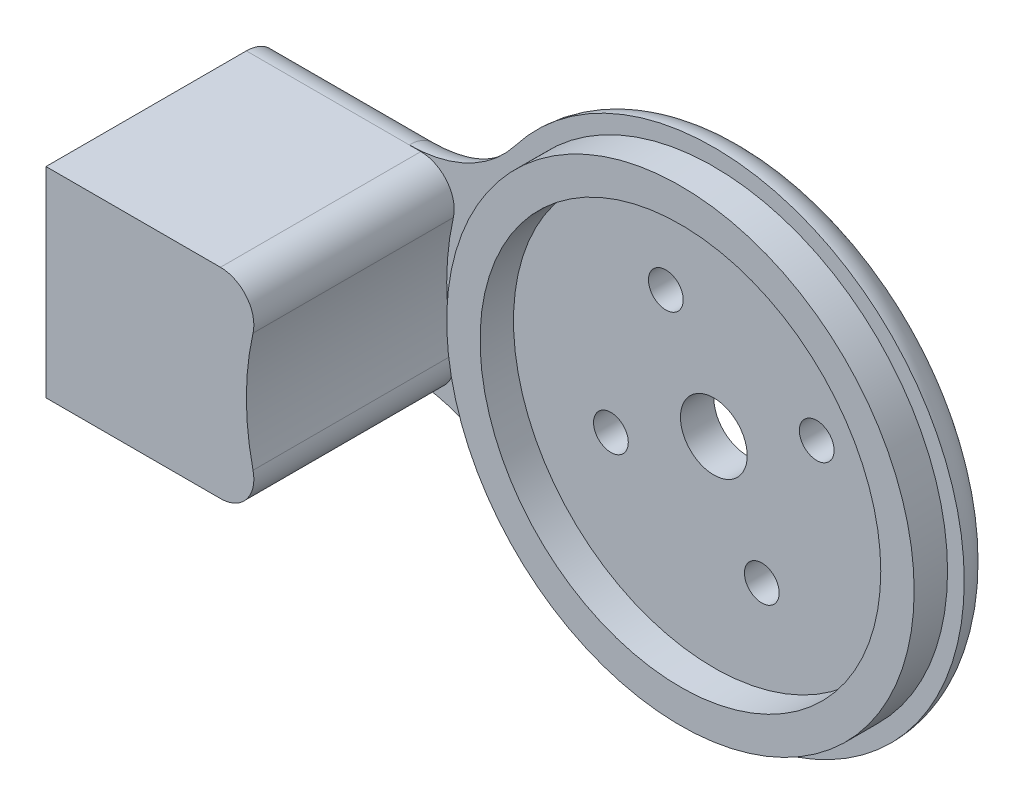
ISO-10303-21;
HEADER;
FILE_DESCRIPTION(('STEP AP214'),'2;1');
FILE_NAME('part.step','',(''),(''),'','','');
FILE_SCHEMA(('AUTOMOTIVE_DESIGN { 1 0 10303 214 1 1 1 1 }'));
ENDSEC;
DATA;
#1=APPLICATION_CONTEXT('core data for automotive mechanical design processes');
#2=APPLICATION_PROTOCOL_DEFINITION('international standard','automotive_design',2000,#1);
#3=PRODUCT_CONTEXT('',#1,'mechanical');
#4=PRODUCT('Part','Part','',(#3));
#5=PRODUCT_RELATED_PRODUCT_CATEGORY('part','',(#4));
#6=PRODUCT_DEFINITION_FORMATION('','',#4);
#7=PRODUCT_DEFINITION_CONTEXT('part definition',#1,'design');
#8=PRODUCT_DEFINITION('design','',#6,#7);
#9=PRODUCT_DEFINITION_SHAPE('','',#8);
#10=(LENGTH_UNIT() NAMED_UNIT(*) SI_UNIT(.MILLI.,.METRE.));
#11=(NAMED_UNIT(*) PLANE_ANGLE_UNIT() SI_UNIT($,.RADIAN.));
#12=(NAMED_UNIT(*) SI_UNIT($,.STERADIAN.) SOLID_ANGLE_UNIT());
#13=UNCERTAINTY_MEASURE_WITH_UNIT(LENGTH_MEASURE(1.E-05),#10,'distance_accuracy_value','');
#14=(GEOMETRIC_REPRESENTATION_CONTEXT(3) GLOBAL_UNCERTAINTY_ASSIGNED_CONTEXT((#13)) GLOBAL_UNIT_ASSIGNED_CONTEXT((#10,
#11,#12)) REPRESENTATION_CONTEXT('',''));
#15=CARTESIAN_POINT('',(0.,0.,0.));
#16=DIRECTION('',(0.,0.,1.));
#17=DIRECTION('',(1.,0.,0.));
#18=AXIS2_PLACEMENT_3D('',#15,#16,#17);
#19=CARTESIAN_POINT('',(-45.6207189772366,35.,5.));
#20=DIRECTION('',(0.,0.,1.));
#21=DIRECTION('',(1.,0.,0.));
#22=AXIS2_PLACEMENT_3D('',#19,#20,#21);
#23=PLANE('',#22);
#24=CARTESIAN_POINT('',(15.4072323796231,7.18451044959179,5.));
#25=DIRECTION('',(0.,0.,1.));
#26=DIRECTION('',(1.,0.,0.));
#27=AXIS2_PLACEMENT_3D('',#24,#25,#26);
#28=CIRCLE('',#27,2.6);
#29=CARTESIAN_POINT('',(18.0072323796231,7.18451044959179,5.));
#30=VERTEX_POINT('',#29);
#31=EDGE_CURVE('E146',#30,#30,#28,.T.);
#32=ORIENTED_EDGE('',*,*,#31,.F.);
#33=EDGE_LOOP('',(#32));
#34=FACE_BOUND('',#33,.T.);
#35=CARTESIAN_POINT('',(-7.18451044959179,15.4072323796231,5.));
#36=DIRECTION('',(0.,0.,1.));
#37=DIRECTION('',(1.,0.,0.));
#38=AXIS2_PLACEMENT_3D('',#35,#36,#37);
#39=CIRCLE('',#38,2.6);
#40=CARTESIAN_POINT('',(-4.58451044959179,15.4072323796231,5.));
#41=VERTEX_POINT('',#40);
#42=EDGE_CURVE('E453',#41,#41,#39,.T.);
#43=ORIENTED_EDGE('',*,*,#42,.F.);
#44=EDGE_LOOP('',(#43));
#45=FACE_BOUND('',#44,.T.);
#46=CARTESIAN_POINT('',(-15.4072323796231,-7.18451044959179,5.));
#47=DIRECTION('',(0.,0.,1.));
#48=DIRECTION('',(1.,0.,0.));
#49=AXIS2_PLACEMENT_3D('',#46,#47,#48);
#50=CIRCLE('',#49,2.6);
#51=CARTESIAN_POINT('',(-12.8072323796231,-7.18451044959179,5.));
#52=VERTEX_POINT('',#51);
#53=EDGE_CURVE('E441',#52,#52,#50,.T.);
#54=ORIENTED_EDGE('',*,*,#53,.F.);
#55=EDGE_LOOP('',(#54));
#56=FACE_BOUND('',#55,.T.);
#57=CARTESIAN_POINT('',(7.18451044959179,-15.4072323796231,5.));
#58=DIRECTION('',(0.,0.,1.));
#59=DIRECTION('',(1.,0.,0.));
#60=AXIS2_PLACEMENT_3D('',#57,#58,#59);
#61=CIRCLE('',#60,2.6);
#62=CARTESIAN_POINT('',(9.78451044959179,-15.4072323796231,5.));
#63=VERTEX_POINT('',#62);
#64=EDGE_CURVE('E438',#63,#63,#61,.T.);
#65=ORIENTED_EDGE('',*,*,#64,.F.);
#66=EDGE_LOOP('',(#65));
#67=FACE_BOUND('',#66,.T.);
#68=CARTESIAN_POINT('',(0.,0.,5.));
#69=DIRECTION('',(0.,0.,1.));
#70=DIRECTION('',(1.,0.,0.));
#71=AXIS2_PLACEMENT_3D('',#68,#69,#70);
#72=CIRCLE('',#71,5.);
#73=CARTESIAN_POINT('',(5.,0.,5.));
#74=VERTEX_POINT('',#73);
#75=EDGE_CURVE('E186',#74,#74,#72,.T.);
#76=ORIENTED_EDGE('',*,*,#75,.F.);
#77=EDGE_LOOP('',(#76));
#78=FACE_BOUND('',#77,.T.);
#79=CARTESIAN_POINT('',(0.,0.,5.));
#80=DIRECTION('',(0.,0.,1.));
#81=DIRECTION('',(1.,0.,0.));
#82=AXIS2_PLACEMENT_3D('',#79,#80,#81);
#83=CIRCLE('',#82,30.);
#84=CARTESIAN_POINT('',(30.,0.,5.));
#85=VERTEX_POINT('',#84);
#86=EDGE_CURVE('E199',#85,#85,#83,.F.);
#87=ORIENTED_EDGE('',*,*,#86,.F.);
#88=EDGE_LOOP('',(#87));
#89=FACE_BOUND('',#88,.T.);
#90=ADVANCED_FACE('F34',(#34,#45,#56,#67,#78,#89),#23,.T.);
#91=CARTESIAN_POINT('',(-45.6207189772366,35.,5.));
#92=DIRECTION('',(0.,0.,-1.));
#93=DIRECTION('',(1.,0.,0.));
#94=AXIS2_PLACEMENT_3D('',#91,#92,#93);
#95=CIRCLE('',#94,20.);
#96=CARTESIAN_POINT('',(-29.7526428112413,22.8260869565217,5.));
#97=VERTEX_POINT('',#96);
#98=CARTESIAN_POINT('',(-45.6207189772366,15.,5.));
#99=VERTEX_POINT('',#98);
#100=EDGE_CURVE('E125',#97,#99,#95,.T.);
#101=ORIENTED_EDGE('',*,*,#100,.T.);
#102=DIRECTION('',(-1.,0.,0.));
#103=VECTOR('',#102,1.);
#104=CARTESIAN_POINT('',(-70.0000000000001,15.,5.));
#105=LINE('',#104,#103);
#106=CARTESIAN_POINT('',(-43.8748219369606,15.,5.));
#107=VERTEX_POINT('',#106);
#108=EDGE_CURVE('E156',#107,#99,#105,.T.);
#109=ORIENTED_EDGE('',*,*,#108,.F.);
#110=CARTESIAN_POINT('',(-43.8748219369606,10.,5.));
#111=DIRECTION('',(0.,0.,1.));
#112=DIRECTION('',(-1.,0.,0.));
#113=AXIS2_PLACEMENT_3D('',#110,#111,#112);
#114=CIRCLE('',#113,5.);
#115=CARTESIAN_POINT('',(-38.9998417217428,8.88888888888889,5.));
#116=VERTEX_POINT('',#115);
#117=EDGE_CURVE('E140',#116,#107,#114,.T.);
#118=ORIENTED_EDGE('',*,*,#117,.F.);
#119=CARTESIAN_POINT('',(0.,0.,5.));
#120=DIRECTION('',(0.,0.,-1.));
#121=DIRECTION('',(1.,0.,0.));
#122=AXIS2_PLACEMENT_3D('',#119,#120,#121);
#123=CIRCLE('',#122,40.);
#124=CARTESIAN_POINT('',(-38.9998417217428,-8.88888888888889,5.));
#125=VERTEX_POINT('',#124);
#126=EDGE_CURVE('E143',#125,#116,#123,.T.);
#127=ORIENTED_EDGE('',*,*,#126,.F.);
#128=CARTESIAN_POINT('',(-43.8748219369606,-10.,5.));
#129=DIRECTION('',(0.,0.,1.));
#130=DIRECTION('',(1.,0.,0.));
#131=AXIS2_PLACEMENT_3D('',#128,#129,#130);
#132=CIRCLE('',#131,5.);
#133=CARTESIAN_POINT('',(-43.8748219369606,-15.,5.));
#134=VERTEX_POINT('',#133);
#135=EDGE_CURVE('E161',#134,#125,#132,.T.);
#136=ORIENTED_EDGE('',*,*,#135,.F.);
#137=DIRECTION('',(1.,0.,0.));
#138=VECTOR('',#137,1.);
#139=CARTESIAN_POINT('',(-70.0000000000001,-15.,5.));
#140=LINE('',#139,#138);
#141=CARTESIAN_POINT('',(-45.6207189772366,-15.,5.));
#142=VERTEX_POINT('',#141);
#143=EDGE_CURVE('E158',#142,#134,#140,.T.);
#144=ORIENTED_EDGE('',*,*,#143,.F.);
#145=CARTESIAN_POINT('',(-45.6207189772366,-35.,5.));
#146=DIRECTION('',(0.,0.,-1.));
#147=DIRECTION('',(-1.,0.,0.));
#148=AXIS2_PLACEMENT_3D('',#145,#146,#147);
#149=CIRCLE('',#148,20.);
#150=CARTESIAN_POINT('',(-29.7526428112413,-22.8260869565217,5.));
#151=VERTEX_POINT('',#150);
#152=EDGE_CURVE('E192',#142,#151,#149,.T.);
#153=ORIENTED_EDGE('',*,*,#152,.T.);
#154=CARTESIAN_POINT('',(0.,0.,5.));
#155=DIRECTION('',(0.,0.,1.));
#156=DIRECTION('',(1.,0.,0.));
#157=AXIS2_PLACEMENT_3D('',#154,#155,#156);
#158=CIRCLE('',#157,37.5);
#159=EDGE_CURVE('E194',#151,#97,#158,.T.);
#160=ORIENTED_EDGE('',*,*,#159,.T.);
#161=EDGE_LOOP('',(#101,#109,#118,#127,#136,#144,#153,#160));
#162=FACE_BOUND('',#161,.T.);
#163=CARTESIAN_POINT('',(0.,0.,5.));
#164=DIRECTION('',(0.,0.,1.));
#165=DIRECTION('',(1.,0.,0.));
#166=AXIS2_PLACEMENT_3D('',#163,#164,#165);
#167=CIRCLE('',#166,35.);
#168=CARTESIAN_POINT('',(35.,0.,5.));
#169=VERTEX_POINT('',#168);
#170=EDGE_CURVE('E179',#169,#169,#167,.T.);
#171=ORIENTED_EDGE('',*,*,#170,.F.);
#172=EDGE_LOOP('',(#171));
#173=FACE_BOUND('',#172,.T.);
#174=ADVANCED_FACE('F252',(#162,#173),#23,.T.);
#175=CARTESIAN_POINT('',(-45.6207189772366,35.,0.));
#176=DIRECTION('',(0.,0.,1.));
#177=DIRECTION('',(1.,0.,0.));
#178=AXIS2_PLACEMENT_3D('',#175,#176,#177);
#179=PLANE('',#178);
#180=CARTESIAN_POINT('',(15.4072323796231,7.18451044959179,0.));
#181=DIRECTION('',(0.,0.,-1.));
#182=DIRECTION('',(-1.,0.,0.));
#183=AXIS2_PLACEMENT_3D('',#180,#181,#182);
#184=CIRCLE('',#183,2.6);
#185=CARTESIAN_POINT('',(12.8072323796231,7.18451044959179,0.));
#186=VERTEX_POINT('',#185);
#187=EDGE_CURVE('E437',#186,#186,#184,.T.);
#188=ORIENTED_EDGE('',*,*,#187,.F.);
#189=EDGE_LOOP('',(#188));
#190=FACE_BOUND('',#189,.T.);
#191=CARTESIAN_POINT('',(-7.18451044959179,15.4072323796231,0.));
#192=DIRECTION('',(0.,0.,-1.));
#193=DIRECTION('',(-1.,0.,0.));
#194=AXIS2_PLACEMENT_3D('',#191,#192,#193);
#195=CIRCLE('',#194,2.6);
#196=CARTESIAN_POINT('',(-9.78451044959179,15.4072323796231,0.));
#197=VERTEX_POINT('',#196);
#198=EDGE_CURVE('E439',#197,#197,#195,.T.);
#199=ORIENTED_EDGE('',*,*,#198,.F.);
#200=EDGE_LOOP('',(#199));
#201=FACE_BOUND('',#200,.T.);
#202=CARTESIAN_POINT('',(-15.4072323796231,-7.18451044959179,0.));
#203=DIRECTION('',(0.,0.,-1.));
#204=DIRECTION('',(-1.,0.,0.));
#205=AXIS2_PLACEMENT_3D('',#202,#203,#204);
#206=CIRCLE('',#205,2.6);
#207=CARTESIAN_POINT('',(-18.0072323796231,-7.18451044959179,0.));
#208=VERTEX_POINT('',#207);
#209=EDGE_CURVE('E444',#208,#208,#206,.T.);
#210=ORIENTED_EDGE('',*,*,#209,.F.);
#211=EDGE_LOOP('',(#210));
#212=FACE_BOUND('',#211,.T.);
#213=CARTESIAN_POINT('',(7.18451044959179,-15.4072323796231,0.));
#214=DIRECTION('',(0.,0.,-1.));
#215=DIRECTION('',(-1.,0.,0.));
#216=AXIS2_PLACEMENT_3D('',#213,#214,#215);
#217=CIRCLE('',#216,2.6);
#218=CARTESIAN_POINT('',(4.58451044959179,-15.4072323796231,0.));
#219=VERTEX_POINT('',#218);
#220=EDGE_CURVE('E449',#219,#219,#217,.T.);
#221=ORIENTED_EDGE('',*,*,#220,.F.);
#222=EDGE_LOOP('',(#221));
#223=FACE_BOUND('',#222,.T.);
#224=CARTESIAN_POINT('',(-45.6207189772366,-35.,0.));
#225=DIRECTION('',(0.,0.,1.));
#226=DIRECTION('',(1.,0.,0.));
#227=AXIS2_PLACEMENT_3D('',#224,#225,#226);
#228=CIRCLE('',#227,25.);
#229=CARTESIAN_POINT('',(-25.7856237697425,-19.7826086956522,0.));
#230=VERTEX_POINT('',#229);
#231=CARTESIAN_POINT('',(-45.6207189772366,-10.,0.));
#232=VERTEX_POINT('',#231);
#233=EDGE_CURVE('E57',#230,#232,#228,.T.);
#234=ORIENTED_EDGE('',*,*,#233,.T.);
#235=DIRECTION('',(1.,0.,0.));
#236=VECTOR('',#235,1.);
#237=CARTESIAN_POINT('',(-45.6207189772367,-10.,0.));
#238=LINE('',#237,#236);
#239=CARTESIAN_POINT('',(-70.0000000000001,-10.,0.));
#240=VERTEX_POINT('',#239);
#241=EDGE_CURVE('E212',#232,#240,#238,.F.);
#242=ORIENTED_EDGE('',*,*,#241,.T.);
#243=DIRECTION('',(0.,-1.,0.));
#244=VECTOR('',#243,1.);
#245=CARTESIAN_POINT('',(-70.0000000000001,-15.,0.));
#246=LINE('',#245,#244);
#247=CARTESIAN_POINT('',(-70.0000000000001,10.,0.));
#248=VERTEX_POINT('',#247);
#249=EDGE_CURVE('E189',#248,#240,#246,.T.);
#250=ORIENTED_EDGE('',*,*,#249,.F.);
#251=DIRECTION('',(-1.,0.,0.));
#252=VECTOR('',#251,1.);
#253=CARTESIAN_POINT('',(-45.6207189772366,10.,0.));
#254=LINE('',#253,#252);
#255=CARTESIAN_POINT('',(-45.6207189772366,10.,0.));
#256=VERTEX_POINT('',#255);
#257=EDGE_CURVE('E205',#248,#256,#254,.F.);
#258=ORIENTED_EDGE('',*,*,#257,.T.);
#259=CARTESIAN_POINT('',(-45.6207189772366,35.,0.));
#260=DIRECTION('',(0.,0.,1.));
#261=DIRECTION('',(1.,0.,0.));
#262=AXIS2_PLACEMENT_3D('',#259,#260,#261);
#263=CIRCLE('',#262,25.);
#264=CARTESIAN_POINT('',(-25.7856237697425,19.7826086956522,0.));
#265=VERTEX_POINT('',#264);
#266=EDGE_CURVE('E207',#256,#265,#263,.T.);
#267=ORIENTED_EDGE('',*,*,#266,.T.);
#268=CARTESIAN_POINT('',(0.,0.,0.));
#269=DIRECTION('',(0.,0.,1.));
#270=DIRECTION('',(1.,0.,0.));
#271=AXIS2_PLACEMENT_3D('',#268,#269,#270);
#272=CIRCLE('',#271,32.5);
#273=EDGE_CURVE('E209',#265,#230,#272,.F.);
#274=ORIENTED_EDGE('',*,*,#273,.T.);
#275=EDGE_LOOP('',(#234,#242,#250,#258,#267,#274));
#276=FACE_BOUND('',#275,.T.);
#277=CARTESIAN_POINT('',(0.,0.,0.));
#278=DIRECTION('',(0.,0.,1.));
#279=DIRECTION('',(1.,0.,0.));
#280=AXIS2_PLACEMENT_3D('',#277,#278,#279);
#281=CIRCLE('',#280,5.);
#282=CARTESIAN_POINT('',(5.,0.,0.));
#283=VERTEX_POINT('',#282);
#284=EDGE_CURVE('E183',#283,#283,#281,.T.);
#285=ORIENTED_EDGE('',*,*,#284,.T.);
#286=EDGE_LOOP('',(#285));
#287=FACE_BOUND('',#286,.T.);
#288=ADVANCED_FACE('F237',(#190,#201,#212,#223,#276,#287),#179,.F.);
#289=CARTESIAN_POINT('',(-70.0000000000001,-15.,5.));
#290=DIRECTION('',(1.,0.,0.));
#291=DIRECTION('',(0.,0.,-1.));
#292=AXIS2_PLACEMENT_3D('',#289,#290,#291);
#293=PLANE('',#292);
#294=ORIENTED_EDGE('',*,*,#249,.T.);
#295=CARTESIAN_POINT('',(-70.0000000000001,-10.,5.));
#296=DIRECTION('',(1.,0.,0.));
#297=DIRECTION('',(0.,0.,-1.));
#298=AXIS2_PLACEMENT_3D('',#295,#296,#297);
#299=CIRCLE('',#298,5.);
#300=CARTESIAN_POINT('',(-70.0000000000001,-15.,5.));
#301=VERTEX_POINT('',#300);
#302=EDGE_CURVE('E43',#240,#301,#299,.F.);
#303=ORIENTED_EDGE('',*,*,#302,.T.);
#304=DIRECTION('',(0.,0.,-1.));
#305=VECTOR('',#304,1.);
#306=CARTESIAN_POINT('',(-70.0000000000001,-15.,5.));
#307=LINE('',#306,#305);
#308=CARTESIAN_POINT('',(-70.0000000000001,-15.,35.));
#309=VERTEX_POINT('',#308);
#310=EDGE_CURVE('E124',#309,#301,#307,.T.);
#311=ORIENTED_EDGE('',*,*,#310,.F.);
#312=DIRECTION('',(0.,-1.,0.));
#313=VECTOR('',#312,1.);
#314=CARTESIAN_POINT('',(-70.0000000000001,-15.,35.));
#315=LINE('',#314,#313);
#316=CARTESIAN_POINT('',(-70.0000000000001,15.,35.));
#317=VERTEX_POINT('',#316);
#318=EDGE_CURVE('E128',#317,#309,#315,.T.);
#319=ORIENTED_EDGE('',*,*,#318,.F.);
#320=DIRECTION('',(0.,0.,-1.));
#321=VECTOR('',#320,1.);
#322=CARTESIAN_POINT('',(-70.0000000000001,15.,5.));
#323=LINE('',#322,#321);
#324=CARTESIAN_POINT('',(-70.0000000000001,15.,5.));
#325=VERTEX_POINT('',#324);
#326=EDGE_CURVE('E116',#317,#325,#323,.T.);
#327=ORIENTED_EDGE('',*,*,#326,.T.);
#328=CARTESIAN_POINT('',(-70.0000000000001,10.,5.));
#329=DIRECTION('',(1.,0.,0.));
#330=DIRECTION('',(0.,0.,-1.));
#331=AXIS2_PLACEMENT_3D('',#328,#329,#330);
#332=CIRCLE('',#331,5.);
#333=EDGE_CURVE('E214',#325,#248,#332,.F.);
#334=ORIENTED_EDGE('',*,*,#333,.T.);
#335=EDGE_LOOP('',(#294,#303,#311,#319,#327,#334));
#336=FACE_BOUND('',#335,.T.);
#337=ADVANCED_FACE('F130',(#336),#293,.F.);
#338=CARTESIAN_POINT('',(-45.6207189772366,-15.,5.));
#339=DIRECTION('',(0.,1.,0.));
#340=DIRECTION('',(-1.,0.,0.));
#341=AXIS2_PLACEMENT_3D('',#338,#339,#340);
#342=PLANE('',#341);
#343=ORIENTED_EDGE('',*,*,#310,.T.);
#344=DIRECTION('',(1.,0.,0.));
#345=VECTOR('',#344,1.);
#346=CARTESIAN_POINT('',(-45.6207189772366,-15.,5.));
#347=LINE('',#346,#345);
#348=EDGE_CURVE('E202',#301,#142,#347,.T.);
#349=ORIENTED_EDGE('',*,*,#348,.T.);
#350=ORIENTED_EDGE('',*,*,#143,.T.);
#351=DIRECTION('',(0.,0.,-1.));
#352=VECTOR('',#351,1.);
#353=CARTESIAN_POINT('',(-43.8748219369606,-15.,35.));
#354=LINE('',#353,#352);
#355=CARTESIAN_POINT('',(-43.8748219369606,-15.,35.));
#356=VERTEX_POINT('',#355);
#357=EDGE_CURVE('E173',#356,#134,#354,.T.);
#358=ORIENTED_EDGE('',*,*,#357,.F.);
#359=DIRECTION('',(1.,0.,0.));
#360=VECTOR('',#359,1.);
#361=CARTESIAN_POINT('',(-70.0000000000001,-15.,35.));
#362=LINE('',#361,#360);
#363=EDGE_CURVE('E134',#309,#356,#362,.T.);
#364=ORIENTED_EDGE('',*,*,#363,.F.);
#365=EDGE_LOOP('',(#343,#349,#350,#358,#364));
#366=FACE_BOUND('',#365,.T.);
#367=ADVANCED_FACE('F250',(#366),#342,.F.);
#368=CARTESIAN_POINT('',(-45.6207189772366,15.,5.));
#369=DIRECTION('',(0.,-1.,0.));
#370=DIRECTION('',(1.,0.,0.));
#371=AXIS2_PLACEMENT_3D('',#368,#369,#370);
#372=PLANE('',#371);
#373=ORIENTED_EDGE('',*,*,#108,.T.);
#374=DIRECTION('',(-1.,0.,0.));
#375=VECTOR('',#374,1.);
#376=CARTESIAN_POINT('',(-45.6207189772366,15.,5.));
#377=LINE('',#376,#375);
#378=EDGE_CURVE('E11',#99,#325,#377,.T.);
#379=ORIENTED_EDGE('',*,*,#378,.T.);
#380=ORIENTED_EDGE('',*,*,#326,.F.);
#381=DIRECTION('',(-1.,0.,0.));
#382=VECTOR('',#381,1.);
#383=CARTESIAN_POINT('',(-70.0000000000001,15.,35.));
#384=LINE('',#383,#382);
#385=CARTESIAN_POINT('',(-43.8748219369606,15.,35.));
#386=VERTEX_POINT('',#385);
#387=EDGE_CURVE('E121',#386,#317,#384,.T.);
#388=ORIENTED_EDGE('',*,*,#387,.F.);
#389=DIRECTION('',(0.,0.,-1.));
#390=VECTOR('',#389,1.);
#391=CARTESIAN_POINT('',(-43.8748219369606,15.,35.));
#392=LINE('',#391,#390);
#393=EDGE_CURVE('E155',#386,#107,#392,.T.);
#394=ORIENTED_EDGE('',*,*,#393,.T.);
#395=EDGE_LOOP('',(#373,#379,#380,#388,#394));
#396=FACE_BOUND('',#395,.T.);
#397=ADVANCED_FACE('F118',(#396),#372,.F.);
#398=CARTESIAN_POINT('',(0.,0.,5.));
#399=DIRECTION('',(0.,0.,-1.));
#400=DIRECTION('',(-1.,0.,0.));
#401=AXIS2_PLACEMENT_3D('',#398,#399,#400);
#402=CYLINDRICAL_SURFACE('',#401,5.);
#403=ORIENTED_EDGE('',*,*,#75,.T.);
#404=EDGE_LOOP('',(#403));
#405=FACE_BOUND('',#404,.T.);
#406=ORIENTED_EDGE('',*,*,#284,.F.);
#407=EDGE_LOOP('',(#406));
#408=FACE_BOUND('',#407,.T.);
#409=ADVANCED_FACE('F282',(#405,#408),#402,.F.);
#410=CARTESIAN_POINT('',(0.,0.,10.));
#411=DIRECTION('',(0.,0.,1.));
#412=DIRECTION('',(1.,0.,0.));
#413=AXIS2_PLACEMENT_3D('',#410,#411,#412);
#414=PLANE('',#413);
#415=CARTESIAN_POINT('',(0.,0.,10.));
#416=DIRECTION('',(0.,0.,1.));
#417=DIRECTION('',(1.,0.,0.));
#418=AXIS2_PLACEMENT_3D('',#415,#416,#417);
#419=CIRCLE('',#418,35.);
#420=CARTESIAN_POINT('',(35.,0.,10.));
#421=VERTEX_POINT('',#420);
#422=EDGE_CURVE('E180',#421,#421,#419,.T.);
#423=ORIENTED_EDGE('',*,*,#422,.T.);
#424=EDGE_LOOP('',(#423));
#425=FACE_BOUND('',#424,.T.);
#426=CARTESIAN_POINT('',(0.,0.,10.));
#427=DIRECTION('',(0.,0.,1.));
#428=DIRECTION('',(1.,0.,0.));
#429=AXIS2_PLACEMENT_3D('',#426,#427,#428);
#430=CIRCLE('',#429,30.);
#431=CARTESIAN_POINT('',(30.,0.,10.));
#432=VERTEX_POINT('',#431);
#433=EDGE_CURVE('E176',#432,#432,#430,.T.);
#434=ORIENTED_EDGE('',*,*,#433,.F.);
#435=EDGE_LOOP('',(#434));
#436=FACE_BOUND('',#435,.T.);
#437=ADVANCED_FACE('F324',(#425,#436),#414,.T.);
#438=CARTESIAN_POINT('',(0.,0.,10.));
#439=DIRECTION('',(0.,0.,-1.));
#440=DIRECTION('',(-1.,0.,0.));
#441=AXIS2_PLACEMENT_3D('',#438,#439,#440);
#442=CYLINDRICAL_SURFACE('',#441,35.);
#443=ORIENTED_EDGE('',*,*,#422,.F.);
#444=EDGE_LOOP('',(#443));
#445=FACE_BOUND('',#444,.T.);
#446=ORIENTED_EDGE('',*,*,#170,.T.);
#447=EDGE_LOOP('',(#446));
#448=FACE_BOUND('',#447,.T.);
#449=ADVANCED_FACE('F322',(#445,#448),#442,.T.);
#450=CARTESIAN_POINT('',(0.,0.,10.));
#451=DIRECTION('',(0.,0.,-1.));
#452=DIRECTION('',(-1.,0.,0.));
#453=AXIS2_PLACEMENT_3D('',#450,#451,#452);
#454=CYLINDRICAL_SURFACE('',#453,30.);
#455=ORIENTED_EDGE('',*,*,#433,.T.);
#456=EDGE_LOOP('',(#455));
#457=FACE_BOUND('',#456,.T.);
#458=ORIENTED_EDGE('',*,*,#86,.T.);
#459=EDGE_LOOP('',(#458));
#460=FACE_BOUND('',#459,.T.);
#461=ADVANCED_FACE('F319',(#457,#460),#454,.F.);
#462=CARTESIAN_POINT('',(-43.8748219369606,-10.,35.));
#463=DIRECTION('',(0.,0.,-1.));
#464=DIRECTION('',(-1.,0.,0.));
#465=AXIS2_PLACEMENT_3D('',#462,#463,#464);
#466=CYLINDRICAL_SURFACE('',#465,5.);
#467=ORIENTED_EDGE('',*,*,#135,.T.);
#468=DIRECTION('',(0.,0.,-1.));
#469=VECTOR('',#468,1.);
#470=CARTESIAN_POINT('',(-38.9998417217428,-8.88888888888889,35.));
#471=LINE('',#470,#469);
#472=CARTESIAN_POINT('',(-38.9998417217428,-8.88888888888889,35.));
#473=VERTEX_POINT('',#472);
#474=EDGE_CURVE('E170',#473,#125,#471,.T.);
#475=ORIENTED_EDGE('',*,*,#474,.F.);
#476=CARTESIAN_POINT('',(-43.8748219369606,-10.,35.));
#477=DIRECTION('',(0.,0.,1.));
#478=DIRECTION('',(1.,0.,0.));
#479=AXIS2_PLACEMENT_3D('',#476,#477,#478);
#480=CIRCLE('',#479,5.);
#481=EDGE_CURVE('E150',#356,#473,#480,.T.);
#482=ORIENTED_EDGE('',*,*,#481,.F.);
#483=ORIENTED_EDGE('',*,*,#357,.T.);
#484=EDGE_LOOP('',(#467,#475,#482,#483));
#485=FACE_BOUND('',#484,.T.);
#486=ADVANCED_FACE('F256',(#485),#466,.T.);
#487=CARTESIAN_POINT('',(0.,0.,35.));
#488=DIRECTION('',(0.,0.,-1.));
#489=DIRECTION('',(-1.,0.,0.));
#490=AXIS2_PLACEMENT_3D('',#487,#488,#489);
#491=CYLINDRICAL_SURFACE('',#490,40.);
#492=ORIENTED_EDGE('',*,*,#126,.T.);
#493=DIRECTION('',(0.,0.,-1.));
#494=VECTOR('',#493,1.);
#495=CARTESIAN_POINT('',(-38.9998417217428,8.88888888888889,35.));
#496=LINE('',#495,#494);
#497=CARTESIAN_POINT('',(-38.9998417217428,8.88888888888889,35.));
#498=VERTEX_POINT('',#497);
#499=EDGE_CURVE('E167',#498,#116,#496,.T.);
#500=ORIENTED_EDGE('',*,*,#499,.F.);
#501=CARTESIAN_POINT('',(0.,0.,35.));
#502=DIRECTION('',(0.,0.,-1.));
#503=DIRECTION('',(1.,0.,0.));
#504=AXIS2_PLACEMENT_3D('',#501,#502,#503);
#505=CIRCLE('',#504,40.);
#506=EDGE_CURVE('E152',#473,#498,#505,.T.);
#507=ORIENTED_EDGE('',*,*,#506,.F.);
#508=ORIENTED_EDGE('',*,*,#474,.T.);
#509=EDGE_LOOP('',(#492,#500,#507,#508));
#510=FACE_BOUND('',#509,.T.);
#511=ADVANCED_FACE('F260',(#510),#491,.F.);
#512=CARTESIAN_POINT('',(-43.8748219369606,10.,35.));
#513=DIRECTION('',(0.,0.,-1.));
#514=DIRECTION('',(-1.,0.,0.));
#515=AXIS2_PLACEMENT_3D('',#512,#513,#514);
#516=CYLINDRICAL_SURFACE('',#515,5.);
#517=ORIENTED_EDGE('',*,*,#117,.T.);
#518=ORIENTED_EDGE('',*,*,#393,.F.);
#519=CARTESIAN_POINT('',(-43.8748219369606,10.,35.));
#520=DIRECTION('',(0.,0.,1.));
#521=DIRECTION('',(-1.,0.,0.));
#522=AXIS2_PLACEMENT_3D('',#519,#520,#521);
#523=CIRCLE('',#522,5.);
#524=EDGE_CURVE('E138',#498,#386,#523,.T.);
#525=ORIENTED_EDGE('',*,*,#524,.F.);
#526=ORIENTED_EDGE('',*,*,#499,.T.);
#527=EDGE_LOOP('',(#517,#518,#525,#526));
#528=FACE_BOUND('',#527,.T.);
#529=ADVANCED_FACE('F263',(#528),#516,.T.);
#530=CARTESIAN_POINT('',(-43.8748219369606,10.,35.));
#531=DIRECTION('',(0.,0.,-1.));
#532=DIRECTION('',(-1.,0.,0.));
#533=AXIS2_PLACEMENT_3D('',#530,#531,#532);
#534=PLANE('',#533);
#535=ORIENTED_EDGE('',*,*,#387,.T.);
#536=ORIENTED_EDGE('',*,*,#318,.T.);
#537=ORIENTED_EDGE('',*,*,#363,.T.);
#538=ORIENTED_EDGE('',*,*,#481,.T.);
#539=ORIENTED_EDGE('',*,*,#506,.T.);
#540=ORIENTED_EDGE('',*,*,#524,.T.);
#541=EDGE_LOOP('',(#535,#536,#537,#538,#539,#540));
#542=FACE_BOUND('',#541,.T.);
#543=ADVANCED_FACE('F136',(#542),#534,.F.);
#544=CARTESIAN_POINT('',(-45.6207189772366,10.,5.));
#545=DIRECTION('',(-1.,0.,0.));
#546=DIRECTION('',(0.,-1.,0.));
#547=AXIS2_PLACEMENT_3D('',#544,#545,#546);
#548=CYLINDRICAL_SURFACE('',#547,5.);
#549=ORIENTED_EDGE('',*,*,#333,.F.);
#550=ORIENTED_EDGE('',*,*,#378,.F.);
#551=CARTESIAN_POINT('',(-45.6207189772366,10.,5.));
#552=DIRECTION('',(1.,0.,0.));
#553=DIRECTION('',(0.,0.,-1.));
#554=AXIS2_PLACEMENT_3D('',#551,#552,#553);
#555=CIRCLE('',#554,5.);
#556=EDGE_CURVE('E38',#256,#99,#555,.T.);
#557=ORIENTED_EDGE('',*,*,#556,.F.);
#558=ORIENTED_EDGE('',*,*,#257,.F.);
#559=EDGE_LOOP('',(#549,#550,#557,#558));
#560=FACE_BOUND('',#559,.T.);
#561=ADVANCED_FACE('F36',(#560),#548,.T.);
#562=CARTESIAN_POINT('',(-45.6207189772366,35.,5.));
#563=DIRECTION('',(0.,0.,1.));
#564=DIRECTION('',(1.,0.,0.));
#565=AXIS2_PLACEMENT_3D('',#562,#563,#564);
#566=TOROIDAL_SURFACE('',#565,25.,5.);
#567=ORIENTED_EDGE('',*,*,#556,.T.);
#568=ORIENTED_EDGE('',*,*,#100,.F.);
#569=CARTESIAN_POINT('',(-25.7856237697425,19.7826086956522,5.));
#570=DIRECTION('',(0.608695652173913,0.793403808299768,0.));
#571=DIRECTION('',(-0.793403808299768,0.608695652173913,0.));
#572=AXIS2_PLACEMENT_3D('',#569,#570,#571);
#573=CIRCLE('',#572,5.);
#574=EDGE_CURVE('E221',#265,#97,#573,.T.);
#575=ORIENTED_EDGE('',*,*,#574,.F.);
#576=ORIENTED_EDGE('',*,*,#266,.F.);
#577=EDGE_LOOP('',(#567,#568,#575,#576));
#578=FACE_BOUND('',#577,.T.);
#579=ADVANCED_FACE('F232',(#578),#566,.T.);
#580=CARTESIAN_POINT('',(0.,0.,5.));
#581=DIRECTION('',(0.,0.,1.));
#582=DIRECTION('',(1.,0.,0.));
#583=AXIS2_PLACEMENT_3D('',#580,#581,#582);
#584=TOROIDAL_SURFACE('',#583,32.5,5.);
#585=ORIENTED_EDGE('',*,*,#574,.T.);
#586=ORIENTED_EDGE('',*,*,#159,.F.);
#587=CARTESIAN_POINT('',(-25.7856237697425,-19.7826086956522,5.));
#588=DIRECTION('',(-0.608695652173914,0.793403808299767,0.));
#589=DIRECTION('',(-0.793403808299767,-0.608695652173914,0.));
#590=AXIS2_PLACEMENT_3D('',#587,#588,#589);
#591=CIRCLE('',#590,5.);
#592=EDGE_CURVE('E219',#230,#151,#591,.T.);
#593=ORIENTED_EDGE('',*,*,#592,.F.);
#594=ORIENTED_EDGE('',*,*,#273,.F.);
#595=EDGE_LOOP('',(#585,#586,#593,#594));
#596=FACE_BOUND('',#595,.T.);
#597=ADVANCED_FACE('F264',(#596),#584,.T.);
#598=CARTESIAN_POINT('',(-45.6207189772366,-35.,5.));
#599=DIRECTION('',(0.,0.,1.));
#600=DIRECTION('',(1.,0.,0.));
#601=AXIS2_PLACEMENT_3D('',#598,#599,#600);
#602=TOROIDAL_SURFACE('',#601,25.,5.);
#603=ORIENTED_EDGE('',*,*,#592,.T.);
#604=ORIENTED_EDGE('',*,*,#152,.F.);
#605=CARTESIAN_POINT('',(-45.6207189772366,-10.,5.));
#606=DIRECTION('',(-1.,0.,0.));
#607=DIRECTION('',(0.,0.,1.));
#608=AXIS2_PLACEMENT_3D('',#605,#606,#607);
#609=CIRCLE('',#608,5.);
#610=EDGE_CURVE('E217',#232,#142,#609,.T.);
#611=ORIENTED_EDGE('',*,*,#610,.F.);
#612=ORIENTED_EDGE('',*,*,#233,.F.);
#613=EDGE_LOOP('',(#603,#604,#611,#612));
#614=FACE_BOUND('',#613,.T.);
#615=ADVANCED_FACE('F245',(#614),#602,.T.);
#616=CARTESIAN_POINT('',(-45.6207189772366,-10.,5.));
#617=DIRECTION('',(1.,0.,0.));
#618=DIRECTION('',(0.,1.,0.));
#619=AXIS2_PLACEMENT_3D('',#616,#617,#618);
#620=CYLINDRICAL_SURFACE('',#619,5.);
#621=ORIENTED_EDGE('',*,*,#302,.F.);
#622=ORIENTED_EDGE('',*,*,#241,.F.);
#623=ORIENTED_EDGE('',*,*,#610,.T.);
#624=ORIENTED_EDGE('',*,*,#348,.F.);
#625=EDGE_LOOP('',(#621,#622,#623,#624));
#626=FACE_BOUND('',#625,.T.);
#627=ADVANCED_FACE('F241',(#626),#620,.T.);
#628=CARTESIAN_POINT('',(7.18451044959179,-15.4072323796231,35.));
#629=DIRECTION('',(0.,0.,-1.));
#630=DIRECTION('',(-1.,0.,0.));
#631=AXIS2_PLACEMENT_3D('',#628,#629,#630);
#632=CYLINDRICAL_SURFACE('',#631,2.6);
#633=ORIENTED_EDGE('',*,*,#64,.T.);
#634=EDGE_LOOP('',(#633));
#635=FACE_BOUND('',#634,.T.);
#636=ORIENTED_EDGE('',*,*,#220,.T.);
#637=EDGE_LOOP('',(#636));
#638=FACE_BOUND('',#637,.T.);
#639=ADVANCED_FACE('F294',(#635,#638),#632,.F.);
#640=CARTESIAN_POINT('',(-15.4072323796231,-7.18451044959179,35.));
#641=DIRECTION('',(0.,0.,-1.));
#642=DIRECTION('',(-1.,0.,0.));
#643=AXIS2_PLACEMENT_3D('',#640,#641,#642);
#644=CYLINDRICAL_SURFACE('',#643,2.6);
#645=ORIENTED_EDGE('',*,*,#53,.T.);
#646=EDGE_LOOP('',(#645));
#647=FACE_BOUND('',#646,.T.);
#648=ORIENTED_EDGE('',*,*,#209,.T.);
#649=EDGE_LOOP('',(#648));
#650=FACE_BOUND('',#649,.T.);
#651=ADVANCED_FACE('F298',(#647,#650),#644,.F.);
#652=CARTESIAN_POINT('',(-7.18451044959179,15.4072323796231,35.));
#653=DIRECTION('',(0.,0.,-1.));
#654=DIRECTION('',(-1.,0.,0.));
#655=AXIS2_PLACEMENT_3D('',#652,#653,#654);
#656=CYLINDRICAL_SURFACE('',#655,2.6);
#657=ORIENTED_EDGE('',*,*,#42,.T.);
#658=EDGE_LOOP('',(#657));
#659=FACE_BOUND('',#658,.T.);
#660=ORIENTED_EDGE('',*,*,#198,.T.);
#661=EDGE_LOOP('',(#660));
#662=FACE_BOUND('',#661,.T.);
#663=ADVANCED_FACE('F304',(#659,#662),#656,.F.);
#664=CARTESIAN_POINT('',(15.4072323796231,7.18451044959179,35.));
#665=DIRECTION('',(0.,0.,-1.));
#666=DIRECTION('',(-1.,0.,0.));
#667=AXIS2_PLACEMENT_3D('',#664,#665,#666);
#668=CYLINDRICAL_SURFACE('',#667,2.6);
#669=ORIENTED_EDGE('',*,*,#31,.T.);
#670=EDGE_LOOP('',(#669));
#671=FACE_BOUND('',#670,.T.);
#672=ORIENTED_EDGE('',*,*,#187,.T.);
#673=EDGE_LOOP('',(#672));
#674=FACE_BOUND('',#673,.T.);
#675=ADVANCED_FACE('F420',(#671,#674),#668,.F.);
#676=CLOSED_SHELL('',(#90,#174,#288,#337,#367,#397,#409,#437,#449,#461,#486,#511,#529,#543,#561,
#579,#597,#615,#627,#639,#651,#663,#675));
#677=MANIFOLD_SOLID_BREP('B2',#676);
#678=ADVANCED_BREP_SHAPE_REPRESENTATION('',(#18,#677),#14);
#679=SHAPE_DEFINITION_REPRESENTATION(#9,#678);
ENDSEC;
END-ISO-10303-21;
